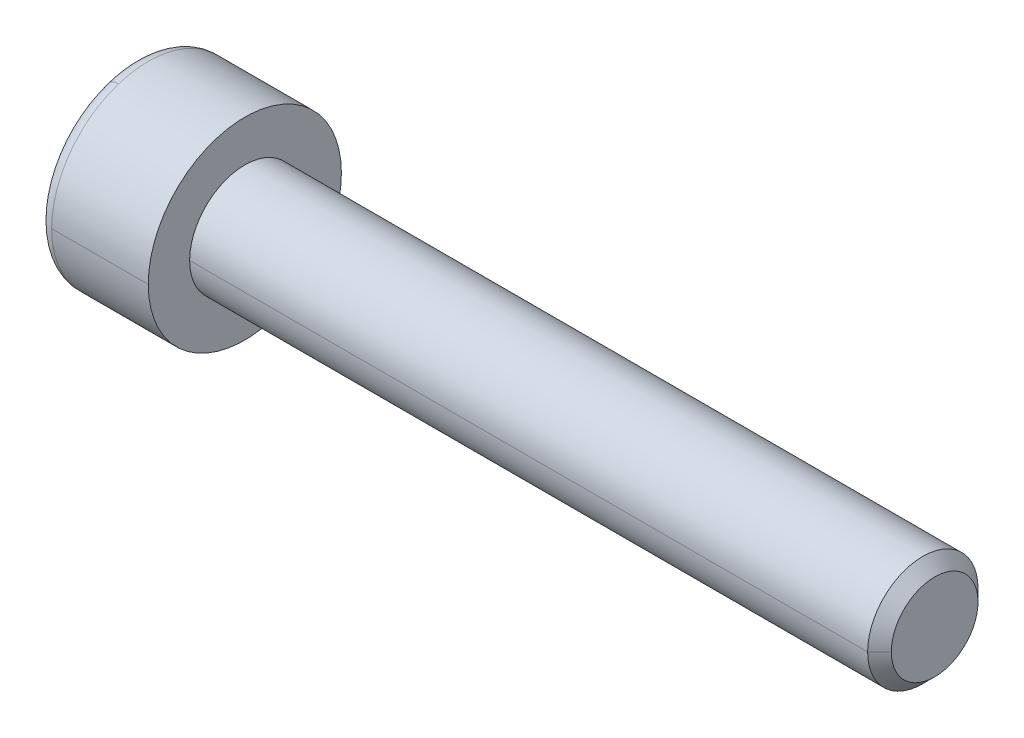
ISO-10303-21;
HEADER;
FILE_DESCRIPTION(('STEP AP214'),'2;1');
FILE_NAME('part.step','',(''),(''),'','','');
FILE_SCHEMA(('AUTOMOTIVE_DESIGN { 1 0 10303 214 1 1 1 1 }'));
ENDSEC;
DATA;
#1=APPLICATION_CONTEXT('core data for automotive mechanical design processes');
#2=APPLICATION_PROTOCOL_DEFINITION('international standard','automotive_design',2000,#1);
#3=PRODUCT_CONTEXT('',#1,'mechanical');
#4=PRODUCT('Part','Part','',(#3));
#5=PRODUCT_RELATED_PRODUCT_CATEGORY('part','',(#4));
#6=PRODUCT_DEFINITION_FORMATION('','',#4);
#7=PRODUCT_DEFINITION_CONTEXT('part definition',#1,'design');
#8=PRODUCT_DEFINITION('design','',#6,#7);
#9=PRODUCT_DEFINITION_SHAPE('','',#8);
#10=(LENGTH_UNIT() NAMED_UNIT(*) SI_UNIT(.MILLI.,.METRE.));
#11=(NAMED_UNIT(*) PLANE_ANGLE_UNIT() SI_UNIT($,.RADIAN.));
#12=(NAMED_UNIT(*) SI_UNIT($,.STERADIAN.) SOLID_ANGLE_UNIT());
#13=UNCERTAINTY_MEASURE_WITH_UNIT(LENGTH_MEASURE(1.E-05),#10,'distance_accuracy_value','');
#14=(GEOMETRIC_REPRESENTATION_CONTEXT(3) GLOBAL_UNCERTAINTY_ASSIGNED_CONTEXT((#13)) GLOBAL_UNIT_ASSIGNED_CONTEXT((#10,
#11,#12)) REPRESENTATION_CONTEXT('',''));
#15=CARTESIAN_POINT('',(0.,0.,0.));
#16=DIRECTION('',(0.,0.,1.));
#17=DIRECTION('',(1.,0.,0.));
#18=AXIS2_PLACEMENT_3D('',#15,#16,#17);
#19=CARTESIAN_POINT('',(-2.,0.,0.));
#20=DIRECTION('',(1.,0.,0.));
#21=DIRECTION('',(0.,0.,-1.));
#22=AXIS2_PLACEMENT_3D('',#19,#20,#21);
#23=PLANE('',#22);
#24=CARTESIAN_POINT('',(-2.,0.,0.));
#25=DIRECTION('',(-1.,0.,0.));
#26=DIRECTION('',(0.,0.,-1.));
#27=AXIS2_PLACEMENT_3D('',#24,#25,#26);
#28=CIRCLE('',#27,1.5);
#29=CARTESIAN_POINT('',(-2.,-1.29903810567665,-0.750000000000014));
#30=VERTEX_POINT('',#29);
#31=CARTESIAN_POINT('',(-2.,-1.29903810567665,0.750000000000014));
#32=VERTEX_POINT('',#31);
#33=EDGE_CURVE('E11',#30,#32,#28,.T.);
#34=ORIENTED_EDGE('',*,*,#33,.F.);
#35=DIRECTION('',(0.,0.500000000000009,-0.866025403784433));
#36=VECTOR('',#35,1.);
#37=CARTESIAN_POINT('',(-2.,-1.7320508075689,0.));
#38=LINE('',#37,#36);
#39=CARTESIAN_POINT('',(-2.,-1.7320508075689,0.));
#40=VERTEX_POINT('',#39);
#41=EDGE_CURVE('E24',#40,#30,#38,.T.);
#42=ORIENTED_EDGE('',*,*,#41,.F.);
#43=DIRECTION('',(0.,-0.500000000000009,-0.866025403784433));
#44=VECTOR('',#43,1.);
#45=CARTESIAN_POINT('',(-2.,-0.86602540378444,1.5));
#46=LINE('',#45,#44);
#47=EDGE_CURVE('E384',#32,#40,#46,.T.);
#48=ORIENTED_EDGE('',*,*,#47,.F.);
#49=EDGE_LOOP('',(#34,#42,#48));
#50=FACE_BOUND('',#49,.T.);
#51=ADVANCED_FACE('F16',(#50),#23,.F.);
#52=CARTESIAN_POINT('',(-2.,-0.86602540378444,1.5));
#53=DIRECTION('',(0.,0.866025403784434,-0.500000000000009));
#54=DIRECTION('',(0.,0.500000000000009,0.866025403784434));
#55=AXIS2_PLACEMENT_3D('',#52,#53,#54);
#56=PLANE('',#55);
#57=DIRECTION('',(0.,-0.500000000000009,-0.866025403784433));
#58=VECTOR('',#57,1.);
#59=CARTESIAN_POINT('',(-4.,-0.86602540378444,1.5));
#60=LINE('',#59,#58);
#61=CARTESIAN_POINT('',(-4.,-0.86602540378444,1.5));
#62=VERTEX_POINT('',#61);
#63=CARTESIAN_POINT('',(-4.,-1.7320508075689,0.));
#64=VERTEX_POINT('',#63);
#65=EDGE_CURVE('E379',#62,#64,#60,.T.);
#66=ORIENTED_EDGE('',*,*,#65,.F.);
#67=DIRECTION('',(-1.,0.,0.));
#68=VECTOR('',#67,1.);
#69=CARTESIAN_POINT('',(-2.,-0.86602540378444,1.5));
#70=LINE('',#69,#68);
#71=CARTESIAN_POINT('',(-2.,-0.86602540378444,1.5));
#72=VERTEX_POINT('',#71);
#73=EDGE_CURVE('E374',#72,#62,#70,.T.);
#74=ORIENTED_EDGE('',*,*,#73,.F.);
#75=DIRECTION('',(0.,-0.500000000000009,-0.866025403784433));
#76=VECTOR('',#75,1.);
#77=CARTESIAN_POINT('',(-2.,-0.86602540378444,1.5));
#78=LINE('',#77,#76);
#79=EDGE_CURVE('E369',#72,#32,#78,.T.);
#80=ORIENTED_EDGE('',*,*,#79,.T.);
#81=ORIENTED_EDGE('',*,*,#47,.T.);
#82=DIRECTION('',(-1.,0.,0.));
#83=VECTOR('',#82,1.);
#84=CARTESIAN_POINT('',(-2.,-1.7320508075689,0.));
#85=LINE('',#84,#83);
#86=EDGE_CURVE('E365',#40,#64,#85,.T.);
#87=ORIENTED_EDGE('',*,*,#86,.T.);
#88=EDGE_LOOP('',(#66,#74,#80,#81,#87));
#89=FACE_BOUND('',#88,.T.);
#90=ADVANCED_FACE('F412',(#89),#56,.T.);
#91=CARTESIAN_POINT('',(-2.,-1.7320508075689,0.));
#92=DIRECTION('',(0.,0.866025403784434,0.500000000000009));
#93=DIRECTION('',(0.,-0.500000000000009,0.866025403784434));
#94=AXIS2_PLACEMENT_3D('',#91,#92,#93);
#95=PLANE('',#94);
#96=DIRECTION('',(0.,0.500000000000009,-0.866025403784433));
#97=VECTOR('',#96,1.);
#98=CARTESIAN_POINT('',(-4.,-1.7320508075689,0.));
#99=LINE('',#98,#97);
#100=CARTESIAN_POINT('',(-4.,-0.86602540378444,-1.5));
#101=VERTEX_POINT('',#100);
#102=EDGE_CURVE('E360',#64,#101,#99,.T.);
#103=ORIENTED_EDGE('',*,*,#102,.F.);
#104=ORIENTED_EDGE('',*,*,#86,.F.);
#105=ORIENTED_EDGE('',*,*,#41,.T.);
#106=DIRECTION('',(0.,0.500000000000009,-0.866025403784433));
#107=VECTOR('',#106,1.);
#108=CARTESIAN_POINT('',(-2.,-1.7320508075689,0.));
#109=LINE('',#108,#107);
#110=CARTESIAN_POINT('',(-2.,-0.86602540378444,-1.5));
#111=VERTEX_POINT('',#110);
#112=EDGE_CURVE('E356',#30,#111,#109,.T.);
#113=ORIENTED_EDGE('',*,*,#112,.T.);
#114=DIRECTION('',(-1.,0.,0.));
#115=VECTOR('',#114,1.);
#116=CARTESIAN_POINT('',(-2.,-0.86602540378444,-1.5));
#117=LINE('',#116,#115);
#118=EDGE_CURVE('E352',#111,#101,#117,.T.);
#119=ORIENTED_EDGE('',*,*,#118,.T.);
#120=EDGE_LOOP('',(#103,#104,#105,#113,#119));
#121=FACE_BOUND('',#120,.T.);
#122=ADVANCED_FACE('F395',(#121),#95,.T.);
#123=CARTESIAN_POINT('',(-2.,-0.86602540378444,-1.5));
#124=DIRECTION('',(0.,0.,1.));
#125=DIRECTION('',(1.,0.,0.));
#126=AXIS2_PLACEMENT_3D('',#123,#124,#125);
#127=PLANE('',#126);
#128=DIRECTION('',(0.,1.,0.));
#129=VECTOR('',#128,1.);
#130=CARTESIAN_POINT('',(-4.,-0.86602540378444,-1.5));
#131=LINE('',#130,#129);
#132=CARTESIAN_POINT('',(-4.,0.86602540378444,-1.5));
#133=VERTEX_POINT('',#132);
#134=EDGE_CURVE('E347',#101,#133,#131,.T.);
#135=ORIENTED_EDGE('',*,*,#134,.F.);
#136=ORIENTED_EDGE('',*,*,#118,.F.);
#137=DIRECTION('',(0.,1.,0.));
#138=VECTOR('',#137,1.);
#139=CARTESIAN_POINT('',(-2.,-0.86602540378444,-1.5));
#140=LINE('',#139,#138);
#141=CARTESIAN_POINT('',(-2.,0.,-1.5));
#142=VERTEX_POINT('',#141);
#143=EDGE_CURVE('E343',#111,#142,#140,.T.);
#144=ORIENTED_EDGE('',*,*,#143,.T.);
#145=DIRECTION('',(0.,1.,0.));
#146=VECTOR('',#145,1.);
#147=CARTESIAN_POINT('',(-2.,-0.86602540378444,-1.5));
#148=LINE('',#147,#146);
#149=CARTESIAN_POINT('',(-2.,0.86602540378444,-1.5));
#150=VERTEX_POINT('',#149);
#151=EDGE_CURVE('E339',#142,#150,#148,.T.);
#152=ORIENTED_EDGE('',*,*,#151,.T.);
#153=DIRECTION('',(-1.,0.,0.));
#154=VECTOR('',#153,1.);
#155=CARTESIAN_POINT('',(-2.,0.86602540378444,-1.5));
#156=LINE('',#155,#154);
#157=EDGE_CURVE('E335',#150,#133,#156,.T.);
#158=ORIENTED_EDGE('',*,*,#157,.T.);
#159=EDGE_LOOP('',(#135,#136,#144,#152,#158));
#160=FACE_BOUND('',#159,.T.);
#161=ADVANCED_FACE('F408',(#160),#127,.T.);
#162=CARTESIAN_POINT('',(-2.,0.86602540378444,-1.5));
#163=DIRECTION('',(0.,-0.866025403784434,0.500000000000009));
#164=DIRECTION('',(0.,-0.500000000000009,-0.866025403784434));
#165=AXIS2_PLACEMENT_3D('',#162,#163,#164);
#166=PLANE('',#165);
#167=DIRECTION('',(0.,0.500000000000009,0.866025403784433));
#168=VECTOR('',#167,1.);
#169=CARTESIAN_POINT('',(-4.,0.86602540378444,-1.5));
#170=LINE('',#169,#168);
#171=CARTESIAN_POINT('',(-4.,1.7320508075689,0.));
#172=VERTEX_POINT('',#171);
#173=EDGE_CURVE('E330',#133,#172,#170,.T.);
#174=ORIENTED_EDGE('',*,*,#173,.F.);
#175=ORIENTED_EDGE('',*,*,#157,.F.);
#176=DIRECTION('',(0.,0.500000000000009,0.866025403784433));
#177=VECTOR('',#176,1.);
#178=CARTESIAN_POINT('',(-2.,0.86602540378444,-1.5));
#179=LINE('',#178,#177);
#180=CARTESIAN_POINT('',(-2.,1.29903810567666,-0.750000000000019));
#181=VERTEX_POINT('',#180);
#182=EDGE_CURVE('E326',#150,#181,#179,.T.);
#183=ORIENTED_EDGE('',*,*,#182,.T.);
#184=DIRECTION('',(0.,0.500000000000009,0.866025403784433));
#185=VECTOR('',#184,1.);
#186=CARTESIAN_POINT('',(-2.,0.86602540378444,-1.5));
#187=LINE('',#186,#185);
#188=CARTESIAN_POINT('',(-2.,1.7320508075689,0.));
#189=VERTEX_POINT('',#188);
#190=EDGE_CURVE('E322',#181,#189,#187,.T.);
#191=ORIENTED_EDGE('',*,*,#190,.T.);
#192=DIRECTION('',(-1.,0.,0.));
#193=VECTOR('',#192,1.);
#194=CARTESIAN_POINT('',(-2.,1.7320508075689,0.));
#195=LINE('',#194,#193);
#196=EDGE_CURVE('E318',#189,#172,#195,.T.);
#197=ORIENTED_EDGE('',*,*,#196,.T.);
#198=EDGE_LOOP('',(#174,#175,#183,#191,#197));
#199=FACE_BOUND('',#198,.T.);
#200=ADVANCED_FACE('F427',(#199),#166,.T.);
#201=CARTESIAN_POINT('',(-2.,1.7320508075689,0.));
#202=DIRECTION('',(0.,-0.866025403784434,-0.500000000000009));
#203=DIRECTION('',(0.,0.500000000000009,-0.866025403784434));
#204=AXIS2_PLACEMENT_3D('',#201,#202,#203);
#205=PLANE('',#204);
#206=DIRECTION('',(0.,-0.500000000000009,0.866025403784433));
#207=VECTOR('',#206,1.);
#208=CARTESIAN_POINT('',(-4.,1.7320508075689,0.));
#209=LINE('',#208,#207);
#210=CARTESIAN_POINT('',(-4.,0.86602540378444,1.5));
#211=VERTEX_POINT('',#210);
#212=EDGE_CURVE('E313',#172,#211,#209,.T.);
#213=ORIENTED_EDGE('',*,*,#212,.F.);
#214=ORIENTED_EDGE('',*,*,#196,.F.);
#215=DIRECTION('',(0.,-0.500000000000009,0.866025403784433));
#216=VECTOR('',#215,1.);
#217=CARTESIAN_POINT('',(-2.,1.7320508075689,0.));
#218=LINE('',#217,#216);
#219=CARTESIAN_POINT('',(-2.,1.29903810567665,0.750000000000014));
#220=VERTEX_POINT('',#219);
#221=EDGE_CURVE('E309',#189,#220,#218,.T.);
#222=ORIENTED_EDGE('',*,*,#221,.T.);
#223=DIRECTION('',(0.,-0.500000000000009,0.866025403784433));
#224=VECTOR('',#223,1.);
#225=CARTESIAN_POINT('',(-2.,1.7320508075689,0.));
#226=LINE('',#225,#224);
#227=CARTESIAN_POINT('',(-2.,0.86602540378444,1.5));
#228=VERTEX_POINT('',#227);
#229=EDGE_CURVE('E305',#220,#228,#226,.T.);
#230=ORIENTED_EDGE('',*,*,#229,.T.);
#231=DIRECTION('',(-1.,0.,0.));
#232=VECTOR('',#231,1.);
#233=CARTESIAN_POINT('',(-2.,0.86602540378444,1.5));
#234=LINE('',#233,#232);
#235=EDGE_CURVE('E301',#228,#211,#234,.T.);
#236=ORIENTED_EDGE('',*,*,#235,.T.);
#237=EDGE_LOOP('',(#213,#214,#222,#230,#236));
#238=FACE_BOUND('',#237,.T.);
#239=ADVANCED_FACE('F430',(#238),#205,.T.);
#240=CARTESIAN_POINT('',(-2.,0.86602540378444,1.5));
#241=DIRECTION('',(0.,0.,-1.));
#242=DIRECTION('',(-1.,0.,0.));
#243=AXIS2_PLACEMENT_3D('',#240,#241,#242);
#244=PLANE('',#243);
#245=DIRECTION('',(0.,-1.,0.));
#246=VECTOR('',#245,1.);
#247=CARTESIAN_POINT('',(-4.,0.86602540378444,1.5));
#248=LINE('',#247,#246);
#249=EDGE_CURVE('E296',#211,#62,#248,.T.);
#250=ORIENTED_EDGE('',*,*,#249,.F.);
#251=ORIENTED_EDGE('',*,*,#235,.F.);
#252=DIRECTION('',(0.,-1.,0.));
#253=VECTOR('',#252,1.);
#254=CARTESIAN_POINT('',(-2.,0.86602540378444,1.5));
#255=LINE('',#254,#253);
#256=CARTESIAN_POINT('',(-2.,0.,1.5));
#257=VERTEX_POINT('',#256);
#258=EDGE_CURVE('E292',#228,#257,#255,.T.);
#259=ORIENTED_EDGE('',*,*,#258,.T.);
#260=DIRECTION('',(0.,-1.,0.));
#261=VECTOR('',#260,1.);
#262=CARTESIAN_POINT('',(-2.,0.86602540378444,1.5));
#263=LINE('',#262,#261);
#264=EDGE_CURVE('E287',#257,#72,#263,.T.);
#265=ORIENTED_EDGE('',*,*,#264,.T.);
#266=ORIENTED_EDGE('',*,*,#73,.T.);
#267=EDGE_LOOP('',(#250,#251,#259,#265,#266));
#268=FACE_BOUND('',#267,.T.);
#269=ADVANCED_FACE('F434',(#268),#244,.T.);
#270=CARTESIAN_POINT('',(-2.,0.,0.));
#271=DIRECTION('',(1.,0.,0.));
#272=DIRECTION('',(0.,0.,-1.));
#273=AXIS2_PLACEMENT_3D('',#270,#271,#272);
#274=PLANE('',#273);
#275=CARTESIAN_POINT('',(-2.,0.,0.));
#276=DIRECTION('',(-1.,0.,0.));
#277=DIRECTION('',(0.,0.,-1.));
#278=AXIS2_PLACEMENT_3D('',#275,#276,#277);
#279=CIRCLE('',#278,1.5);
#280=EDGE_CURVE('E282',#32,#257,#279,.T.);
#281=ORIENTED_EDGE('',*,*,#280,.F.);
#282=ORIENTED_EDGE('',*,*,#79,.F.);
#283=ORIENTED_EDGE('',*,*,#264,.F.);
#284=EDGE_LOOP('',(#281,#282,#283));
#285=FACE_BOUND('',#284,.T.);
#286=ADVANCED_FACE('F438',(#285),#274,.F.);
#287=CARTESIAN_POINT('',(-2.,0.,0.));
#288=DIRECTION('',(-1.,0.,0.));
#289=DIRECTION('',(0.,1.,0.));
#290=AXIS2_PLACEMENT_3D('',#287,#288,#289);
#291=CONICAL_SURFACE('',#290,1.5,1.02974425867667);
#292=DIRECTION('',(-0.515038074910037,0.,-0.857167300702123));
#293=VECTOR('',#292,1.);
#294=CARTESIAN_POINT('',(-1.0987090714587,0.,0.));
#295=LINE('',#294,#293);
#296=CARTESIAN_POINT('',(-1.0987090714587,0.,0.));
#297=VERTEX_POINT('',#296);
#298=EDGE_CURVE('E277',#297,#142,#295,.T.);
#299=ORIENTED_EDGE('',*,*,#298,.T.);
#300=CARTESIAN_POINT('',(-2.,0.,0.));
#301=DIRECTION('',(-1.,0.,0.));
#302=DIRECTION('',(0.,0.,-1.));
#303=AXIS2_PLACEMENT_3D('',#300,#301,#302);
#304=CIRCLE('',#303,1.5);
#305=EDGE_CURVE('E272',#142,#30,#304,.T.);
#306=ORIENTED_EDGE('',*,*,#305,.T.);
#307=ORIENTED_EDGE('',*,*,#33,.T.);
#308=ORIENTED_EDGE('',*,*,#280,.T.);
#309=DIRECTION('',(-0.515038074910037,0.,0.857167300702123));
#310=VECTOR('',#309,1.);
#311=CARTESIAN_POINT('',(-1.0987090714587,0.,0.));
#312=LINE('',#311,#310);
#313=EDGE_CURVE('E267',#297,#257,#312,.T.);
#314=ORIENTED_EDGE('',*,*,#313,.F.);
#315=EDGE_LOOP('',(#299,#306,#307,#308,#314));
#316=FACE_BOUND('',#315,.T.);
#317=ADVANCED_FACE('F400',(#316),#291,.F.);
#318=CARTESIAN_POINT('',(-2.,0.,0.));
#319=DIRECTION('',(-1.,0.,0.));
#320=DIRECTION('',(0.,-1.,0.));
#321=AXIS2_PLACEMENT_3D('',#318,#319,#320);
#322=CONICAL_SURFACE('',#321,1.5,1.02974425867667);
#323=ORIENTED_EDGE('',*,*,#313,.T.);
#324=CARTESIAN_POINT('',(-2.,0.,0.));
#325=DIRECTION('',(-1.,0.,0.));
#326=DIRECTION('',(0.,0.,-1.));
#327=AXIS2_PLACEMENT_3D('',#324,#325,#326);
#328=CIRCLE('',#327,1.5);
#329=EDGE_CURVE('E262',#257,#220,#328,.T.);
#330=ORIENTED_EDGE('',*,*,#329,.T.);
#331=CARTESIAN_POINT('',(-2.,0.,0.));
#332=DIRECTION('',(-1.,0.,0.));
#333=DIRECTION('',(0.,0.,-1.));
#334=AXIS2_PLACEMENT_3D('',#331,#332,#333);
#335=CIRCLE('',#334,1.5);
#336=EDGE_CURVE('E257',#220,#181,#335,.T.);
#337=ORIENTED_EDGE('',*,*,#336,.T.);
#338=CARTESIAN_POINT('',(-2.,0.,0.));
#339=DIRECTION('',(-1.,0.,0.));
#340=DIRECTION('',(0.,0.,-1.));
#341=AXIS2_PLACEMENT_3D('',#338,#339,#340);
#342=CIRCLE('',#341,1.5);
#343=EDGE_CURVE('E254',#181,#142,#342,.T.);
#344=ORIENTED_EDGE('',*,*,#343,.T.);
#345=ORIENTED_EDGE('',*,*,#298,.F.);
#346=EDGE_LOOP('',(#323,#330,#337,#344,#345));
#347=FACE_BOUND('',#346,.T.);
#348=ADVANCED_FACE('F445',(#347),#322,.F.);
#349=CARTESIAN_POINT('',(-2.,0.,0.));
#350=DIRECTION('',(1.,0.,0.));
#351=DIRECTION('',(0.,0.,-1.));
#352=AXIS2_PLACEMENT_3D('',#349,#350,#351);
#353=PLANE('',#352);
#354=ORIENTED_EDGE('',*,*,#343,.F.);
#355=ORIENTED_EDGE('',*,*,#182,.F.);
#356=ORIENTED_EDGE('',*,*,#151,.F.);
#357=EDGE_LOOP('',(#354,#355,#356));
#358=FACE_BOUND('',#357,.T.);
#359=ADVANCED_FACE('F448',(#358),#353,.F.);
#360=CARTESIAN_POINT('',(-2.,0.,0.));
#361=DIRECTION('',(1.,0.,0.));
#362=DIRECTION('',(0.,0.,-1.));
#363=AXIS2_PLACEMENT_3D('',#360,#361,#362);
#364=PLANE('',#363);
#365=ORIENTED_EDGE('',*,*,#336,.F.);
#366=ORIENTED_EDGE('',*,*,#221,.F.);
#367=ORIENTED_EDGE('',*,*,#190,.F.);
#368=EDGE_LOOP('',(#365,#366,#367));
#369=FACE_BOUND('',#368,.T.);
#370=ADVANCED_FACE('F452',(#369),#364,.F.);
#371=CARTESIAN_POINT('',(-2.,0.,0.));
#372=DIRECTION('',(1.,0.,0.));
#373=DIRECTION('',(0.,0.,-1.));
#374=AXIS2_PLACEMENT_3D('',#371,#372,#373);
#375=PLANE('',#374);
#376=ORIENTED_EDGE('',*,*,#329,.F.);
#377=ORIENTED_EDGE('',*,*,#258,.F.);
#378=ORIENTED_EDGE('',*,*,#229,.F.);
#379=EDGE_LOOP('',(#376,#377,#378));
#380=FACE_BOUND('',#379,.T.);
#381=ADVANCED_FACE('F456',(#380),#375,.F.);
#382=CARTESIAN_POINT('',(-2.,0.,0.));
#383=DIRECTION('',(1.,0.,0.));
#384=DIRECTION('',(0.,0.,-1.));
#385=AXIS2_PLACEMENT_3D('',#382,#383,#384);
#386=PLANE('',#385);
#387=ORIENTED_EDGE('',*,*,#305,.F.);
#388=ORIENTED_EDGE('',*,*,#143,.F.);
#389=ORIENTED_EDGE('',*,*,#112,.F.);
#390=EDGE_LOOP('',(#387,#388,#389));
#391=FACE_BOUND('',#390,.T.);
#392=ADVANCED_FACE('F404',(#391),#386,.F.);
#393=CARTESIAN_POINT('',(-4.,0.,0.));
#394=DIRECTION('',(1.,0.,0.));
#395=DIRECTION('',(0.,0.,-1.));
#396=AXIS2_PLACEMENT_3D('',#393,#394,#395);
#397=PLANE('',#396);
#398=CARTESIAN_POINT('',(-4.,2.85316954888554,0.927050983124878));
#399=CARTESIAN_POINT('',(-4.,2.83800168763055,0.973736229612141));
#400=CARTESIAN_POINT('',(-4.,2.82168608911883,1.0200484604974));
#401=CARTESIAN_POINT('',(-4.,2.78680300185109,1.11181694718517));
#402=CARTESIAN_POINT('',(-4.,2.76823551309507,1.15727320298769));
#403=CARTESIAN_POINT('',(-4.,2.7288922296079,1.24721979563124));
#404=CARTESIAN_POINT('',(-4.,2.70811643487675,1.29171013247228));
#405=CARTESIAN_POINT('',(-4.,2.66440689733559,1.37961782284063));
#406=CARTESIAN_POINT('',(-4.,2.64147315452557,1.42303517636794));
#407=CARTESIAN_POINT('',(-4.,2.59350288791136,1.50869227261389));
#408=CARTESIAN_POINT('',(-4.,2.56846636410716,1.55093201533254));
#409=CARTESIAN_POINT('',(-4.,2.51635087273839,1.63413213910462));
#410=CARTESIAN_POINT('',(-4.,2.48927190517383,1.67509252015806));
#411=CARTESIAN_POINT('',(-4.,2.4331367559794,1.75563524120773));
#412=CARTESIAN_POINT('',(-4.,2.40408057434953,1.79521758120396));
#413=CARTESIAN_POINT('',(-4.,2.34406099749456,1.87290886341706));
#414=CARTESIAN_POINT('',(-4.,2.31309760226945,1.91101780563394));
#415=CARTESIAN_POINT('',(-4.,2.24933819133086,1.9856704843473));
#416=CARTESIAN_POINT('',(-4.,2.21654217561738,2.02221422084378));
#417=CARTESIAN_POINT('',(-4.,2.14919653229019,2.09364845109751));
#418=CARTESIAN_POINT('',(-4.,2.11464690467647,2.12853894485475));
#419=CARTESIAN_POINT('',(-4.,2.04387727059746,2.1965826353629));
#420=CARTESIAN_POINT('',(-4.,2.00765726413216,2.22973583211381));
#421=CARTESIAN_POINT('',(-4.,1.9336341295262,2.29422505965755));
#422=CARTESIAN_POINT('',(-4.,1.89583100138555,2.32556109045038));
#423=CARTESIAN_POINT('',(-4.,1.81873269447356,2.38634049483424));
#424=CARTESIAN_POINT('',(-4.,1.77943751570222,2.41578386842527));
#425=CARTESIAN_POINT('',(-4.,1.69944977305696,2.47270702673983));
#426=CARTESIAN_POINT('',(-4.,1.65875720918303,2.50018681146336));
#427=CARTESIAN_POINT('',(-4.,1.57607272828306,2.55311659083452));
#428=CARTESIAN_POINT('',(-4.,1.53408081125701,2.57856658548215));
#429=CARTESIAN_POINT('',(-4.,1.448898786259,2.62737547343527));
#430=CARTESIAN_POINT('',(-4.,1.40570867828704,2.65073436674076));
#431=CARTESIAN_POINT('',(-4.,1.31823432015031,2.69530477838961));
#432=CARTESIAN_POINT('',(-4.,1.27395006998554,2.71651629673298));
#433=CARTESIAN_POINT('',(-4.,1.18439411210069,2.756740858052));
#434=CARTESIAN_POINT('',(-4.,1.13912240438061,2.77575390102764));
#435=CARTESIAN_POINT('',(-4.,1.04770059489435,2.81153570752535));
#436=CARTESIAN_POINT('',(-4.,1.00155049312817,2.82830447104741));
#437=CARTESIAN_POINT('',(-4.,0.90848307518717,2.85955732121783));
#438=CARTESIAN_POINT('',(-4.,0.861565759012337,2.8740414078662));
#439=CARTESIAN_POINT('',(-4.,0.767076940178147,2.90069001085586));
#440=CARTESIAN_POINT('',(-4.,0.71950543751879,2.91285452719715));
#441=CARTESIAN_POINT('',(-4.,0.62382284963223,2.9348346841873));
#442=CARTESIAN_POINT('',(-4.,0.575711764405027,2.94465032483616));
#443=CARTESIAN_POINT('',(-4.,0.479065915201121,2.96190908370337));
#444=CARTESIAN_POINT('',(-4.,0.430531151224417,2.96935220192173));
#445=CARTESIAN_POINT('',(-4.,0.333154869019074,2.98184798480421));
#446=CARTESIAN_POINT('',(-4.,0.284313350790434,2.98690064946833));
#447=CARTESIAN_POINT('',(-4.,0.18644122357664,2.99460335293062));
#448=CARTESIAN_POINT('',(-4.,0.137410614591487,2.99725339172877));
#449=CARTESIAN_POINT('',(-4.,0.0392784248962868,3.00014445928354));
#450=CARTESIAN_POINT('',(-4.,-0.00982315581375952,3.00038548804014));
#451=CARTESIAN_POINT('',(-4.,-0.107978998950024,2.99845795485242));
#452=CARTESIAN_POINT('',(-4.,-0.157033261376243,2.9962893929081));
#453=CARTESIAN_POINT('',(-4.,-0.254976291930022,2.98954790257418));
#454=CARTESIAN_POINT('',(-4.,-0.303865060057583,2.98497497418458));
#455=CARTESIAN_POINT('',(-4.,-0.401359324689475,2.97343576754516));
#456=CARTESIAN_POINT('',(-4.,-0.449964821193807,2.96646948929532));
#457=CARTESIAN_POINT('',(-4.,-0.546775447680826,2.9501603653099));
#458=CARTESIAN_POINT('',(-4.,-0.594980577663513,2.94081751957432));
#459=CARTESIAN_POINT('',(-4.,-0.690874340726841,2.91977776835109));
#460=CARTESIAN_POINT('',(-4.,-0.738562973807483,2.90808086286346));
#461=CARTESIAN_POINT('',(-4.,-0.8333088569726,2.882361171006));
#462=CARTESIAN_POINT('',(-4.,-0.880366107057074,2.86833838463617));
#463=CARTESIAN_POINT('',(-4.,-0.973735859192676,2.83800071313492));
#464=CARTESIAN_POINT('',(-4.,-1.0200483612438,2.82168582800351));
#465=CARTESIAN_POINT('',(-4.,-1.11181704643877,2.78680326296641));
#466=CARTESIAN_POINT('',(-4.,-1.15727322958261,2.76823558306071));
#467=CARTESIAN_POINT('',(-4.,-1.24721976903632,2.72889215964227));
#468=CARTESIAN_POINT('',(-4.,-1.29171012534619,2.70811641612952));
#469=CARTESIAN_POINT('',(-4.,-1.37961782996671,2.66440691608282));
#470=CARTESIAN_POINT('',(-4.,-1.42303517827736,2.64147315954888));
#471=CARTESIAN_POINT('',(-4.,-1.50869227070446,2.59350288288805));
#472=CARTESIAN_POINT('',(-4.,-1.55093201482091,2.56846636276117));
#473=CARTESIAN_POINT('',(-4.,-1.63413213961625,2.51635087408438));
#474=CARTESIAN_POINT('',(-4.,-1.67509252029515,2.48927190553448));
#475=CARTESIAN_POINT('',(-4.,-1.75563524107063,2.43313675561874));
#476=CARTESIAN_POINT('',(-4.,-1.79521758116722,2.4040805742529));
#477=CARTESIAN_POINT('',(-4.,-1.87290886345379,2.3440609975912));
#478=CARTESIAN_POINT('',(-4.,-1.91101780564378,2.31309760229535));
#479=CARTESIAN_POINT('',(-4.,-1.98567048433745,2.24933819130497));
#480=CARTESIAN_POINT('',(-4.,-2.02221422084114,2.21654217561045));
#481=CARTESIAN_POINT('',(-4.,-2.09364845110014,2.14919653229713));
#482=CARTESIAN_POINT('',(-4.,-2.12853894485546,2.11464690467833));
#483=CARTESIAN_POINT('',(-4.,-2.19658263536219,2.0438772705956));
#484=CARTESIAN_POINT('',(-4.,-2.22973583211362,2.00765726413166));
#485=CARTESIAN_POINT('',(-4.,-2.29422505965774,1.9336341295267));
#486=CARTESIAN_POINT('',(-4.,-2.32556109045043,1.89583100138568));
#487=CARTESIAN_POINT('',(-4.,-2.38634049483419,1.81873269447343));
#488=CARTESIAN_POINT('',(-4.,-2.41578386842525,1.77943751570219));
#489=CARTESIAN_POINT('',(-4.,-2.47270702673984,1.69944977305699));
#490=CARTESIAN_POINT('',(-4.,-2.50018681146336,1.65875720918304));
#491=CARTESIAN_POINT('',(-4.,-2.55311659083452,1.57607272828305));
#492=CARTESIAN_POINT('',(-4.,-2.57856658548215,1.53408081125701));
#493=CARTESIAN_POINT('',(-4.,-2.62737547343527,1.448898786259));
#494=CARTESIAN_POINT('',(-4.,-2.65073436674076,1.40570867828704));
#495=CARTESIAN_POINT('',(-4.,-2.69530477838961,1.31823432015032));
#496=CARTESIAN_POINT('',(-4.,-2.71651629673298,1.27395006998555));
#497=CARTESIAN_POINT('',(-4.,-2.756740858052,1.18439411210069));
#498=CARTESIAN_POINT('',(-4.,-2.77575390102765,1.1391224043806));
#499=CARTESIAN_POINT('',(-4.,-2.81153570752534,1.04770059489435));
#500=CARTESIAN_POINT('',(-4.,-2.82830447104737,1.00155049312819));
#501=CARTESIAN_POINT('',(-4.,-2.85955732121787,0.908483075187162));
#502=CARTESIAN_POINT('',(-4.,-2.87404140786634,0.861565759012302));
#503=CARTESIAN_POINT('',(-4.,-2.90069001085572,0.767076940178187));
#504=CARTESIAN_POINT('',(-4.,-2.91285452719663,0.719505437518933));
#505=CARTESIAN_POINT('',(-4.,-2.93483468418781,0.623822849632094));
#506=CARTESIAN_POINT('',(-4.,-2.94465032483808,0.57571176440451));
#507=CARTESIAN_POINT('',(-4.,-2.96190908370145,0.479065915201645));
#508=CARTESIAN_POINT('',(-4.,-2.96935220191456,0.430531151226364));
#509=CARTESIAN_POINT('',(-4.,-2.98184798481137,0.333154869017131));
#510=CARTESIAN_POINT('',(-4.,-2.98690064949507,0.284313350783178));
#511=CARTESIAN_POINT('',(-4.,-2.99460335290388,0.186441223583899));
#512=CARTESIAN_POINT('',(-4.,-2.997253391629,0.137410614618573));
#513=CARTESIAN_POINT('',(-4.,-3.00014445938331,0.0392784248692053));
#514=CARTESIAN_POINT('',(-4.,-3.0003854884125,-0.00982315591483674));
#515=CARTESIAN_POINT('',(-4.,-2.99845795448007,-0.107978998848941));
#516=CARTESIAN_POINT('',(-4.,-2.99628939151844,-0.157033260999004));
#517=CARTESIAN_POINT('',(-4.,-2.98954790396383,-0.254976292307256));
#518=CARTESIAN_POINT('',(-4.,-2.98497497937086,-0.303865061465445));
#519=CARTESIAN_POINT('',(-4.,-2.97343576235888,-0.401359323281609));
#520=CARTESIAN_POINT('',(-4.,-2.96646946993988,-0.449964815939583));
#521=CARTESIAN_POINT('',(-4.,-2.95016038466535,-0.546775452935047));
#522=CARTESIAN_POINT('',(-4.,-2.94081759180981,-0.594980597272538));
#523=CARTESIAN_POINT('',(-4.,-2.9197776961156,-0.690874321117811));
#524=CARTESIAN_POINT('',(-4.,-2.90808059327693,-0.738562900625594));
#525=CARTESIAN_POINT('',(-4.,-2.88236144059252,-0.833308930154483));
#526=CARTESIAN_POINT('',(-4.,-2.86833939074679,-0.880366380175589));
#527=CARTESIAN_POINT('',(-4.,-2.85316954888555,-0.927050983124872));
#528=B_SPLINE_CURVE_WITH_KNOTS('',3,(#398,#399,#400,#401,#402,#403,#404,#405,#406,#407,#408,
#409,#410,#411,#412,#413,#414,#415,#416,#417,#418,#419,#420,#421,#422,#423,#424,#425,#426,#427,
#428,#429,#430,#431,#432,#433,#434,#435,#436,#437,#438,#439,#440,#441,#442,#443,#444,#445,#446,
#447,#448,#449,#450,#451,#452,#453,#454,#455,#456,#457,#458,#459,#460,#461,#462,#463,#464,#465,
#466,#467,#468,#469,#470,#471,#472,#473,#474,#475,#476,#477,#478,#479,#480,#481,#482,#483,#484,
#485,#486,#487,#488,#489,#490,#491,#492,#493,#494,#495,#496,#497,#498,#499,#500,#501,#502,#503,
#504,#505,#506,#507,#508,#509,#510,#511,#512,#513,#514,#515,#516,#517,#518,#519,#520,#521,#522,
#523,#524,#525,#526,#527),.UNSPECIFIED.,.F.,.F.,(4,2,2,2,2,2,2,2,2,2,2,2,2,2,2,2,2,2,2,2,2,2,2,
2,2,2,2,2,2,2,2,2,2,2,2,2,2,2,2,2,2,2,2,2,2,2,2,2,2,2,2,2,2,2,2,2,2,2,2,2,2,2,2,2,4),(0.,
0.147247371137477,0.294494742274956,0.441742113412434,0.588989484549913,0.73623685568739,
0.883484226824869,1.03073159796235,1.17797896909983,1.3252263402373,1.47247371137478,
1.61972108251226,1.76696845364974,1.91421582478721,2.06146319592469,2.20871056706217,
2.35595793819965,2.50320530933713,2.65045268047461,2.79770005161208,2.94494742274956,
3.09219479388704,3.23944216502452,3.386689536162,3.53393690729947,3.68118427843695,
3.82843164957443,3.97567902071191,4.12292639184939,4.27017376298686,4.41742113412434,
4.56466850526182,4.7119158763993,4.85916324753678,5.00641061867425,5.15365798981173,
5.30090536094921,5.44815273208669,5.59540010322417,5.74264747436164,5.88989484549912,
6.0371422166366,6.18438958777408,6.33163695891156,6.47888433004904,6.62613170118651,
6.77337907232399,6.92062644346147,7.06787381459895,7.21512118573643,7.3623685568739,
7.50961592801138,7.65686329914886,7.80411067028634,7.95135804142381,8.09860541256129,
8.24585278369877,8.39310015483625,8.54034752597373,8.68759489711121,8.83484226824869,
8.98208963938616,9.12933701052364,9.27658438166112,9.4238317527986),.UNSPECIFIED.);
#529=CARTESIAN_POINT('',(-4.,2.85316954888555,0.927050983124869));
#530=VERTEX_POINT('',#529);
#531=CARTESIAN_POINT('',(-4.,-2.85316954888555,-0.927050983124869));
#532=VERTEX_POINT('',#531);
#533=EDGE_CURVE('E252',#530,#532,#528,.T.);
#534=ORIENTED_EDGE('',*,*,#533,.F.);
#535=CARTESIAN_POINT('',(-4.,-2.85316954888554,-0.927050983124877));
#536=CARTESIAN_POINT('',(-4.,-2.83800168763055,-0.973736229612141));
#537=CARTESIAN_POINT('',(-4.,-2.82168608911883,-1.0200484604974));
#538=CARTESIAN_POINT('',(-4.,-2.78680300185109,-1.11181694718517));
#539=CARTESIAN_POINT('',(-4.,-2.76823551309507,-1.15727320298769));
#540=CARTESIAN_POINT('',(-4.,-2.7288922296079,-1.24721979563124));
#541=CARTESIAN_POINT('',(-4.,-2.70811643487675,-1.29171013247228));
#542=CARTESIAN_POINT('',(-4.,-2.66440689733559,-1.37961782284062));
#543=CARTESIAN_POINT('',(-4.,-2.64147315452557,-1.42303517636794));
#544=CARTESIAN_POINT('',(-4.,-2.59350288791136,-1.50869227261389));
#545=CARTESIAN_POINT('',(-4.,-2.56846636410716,-1.55093201533254));
#546=CARTESIAN_POINT('',(-4.,-2.51635087273839,-1.63413213910462));
#547=CARTESIAN_POINT('',(-4.,-2.48927190517383,-1.67509252015806));
#548=CARTESIAN_POINT('',(-4.,-2.4331367559794,-1.75563524120773));
#549=CARTESIAN_POINT('',(-4.,-2.40408057434954,-1.79521758120396));
#550=CARTESIAN_POINT('',(-4.,-2.34406099749456,-1.87290886341706));
#551=CARTESIAN_POINT('',(-4.,-2.31309760226945,-1.91101780563393));
#552=CARTESIAN_POINT('',(-4.,-2.24933819133086,-1.98567048434729));
#553=CARTESIAN_POINT('',(-4.,-2.21654217561738,-2.02221422084378));
#554=CARTESIAN_POINT('',(-4.,-2.14919653229019,-2.09364845109751));
#555=CARTESIAN_POINT('',(-4.,-2.11464690467647,-2.12853894485475));
#556=CARTESIAN_POINT('',(-4.,-2.04387727059746,-2.1965826353629));
#557=CARTESIAN_POINT('',(-4.,-2.00765726413216,-2.22973583211381));
#558=CARTESIAN_POINT('',(-4.,-1.9336341295262,-2.29422505965755));
#559=CARTESIAN_POINT('',(-4.,-1.89583100138555,-2.32556109045038));
#560=CARTESIAN_POINT('',(-4.,-1.81873269447356,-2.38634049483424));
#561=CARTESIAN_POINT('',(-4.,-1.77943751570222,-2.41578386842526));
#562=CARTESIAN_POINT('',(-4.,-1.69944977305696,-2.47270702673982));
#563=CARTESIAN_POINT('',(-4.,-1.65875720918303,-2.50018681146336));
#564=CARTESIAN_POINT('',(-4.,-1.57607272828306,-2.55311659083452));
#565=CARTESIAN_POINT('',(-4.,-1.53408081125701,-2.57856658548215));
#566=CARTESIAN_POINT('',(-4.,-1.448898786259,-2.62737547343527));
#567=CARTESIAN_POINT('',(-4.,-1.40570867828704,-2.65073436674076));
#568=CARTESIAN_POINT('',(-4.,-1.31823432015032,-2.69530477838961));
#569=CARTESIAN_POINT('',(-4.,-1.27395006998555,-2.71651629673298));
#570=CARTESIAN_POINT('',(-4.,-1.18439411210069,-2.75674085805199));
#571=CARTESIAN_POINT('',(-4.,-1.13912240438061,-2.77575390102764));
#572=CARTESIAN_POINT('',(-4.,-1.04770059489435,-2.81153570752535));
#573=CARTESIAN_POINT('',(-4.,-1.00155049312818,-2.8283044710474));
#574=CARTESIAN_POINT('',(-4.,-0.908483075187173,-2.85955732121783));
#575=CARTESIAN_POINT('',(-4.,-0.86156575901234,-2.8740414078662));
#576=CARTESIAN_POINT('',(-4.,-0.76707694017815,-2.90069001085586));
#577=CARTESIAN_POINT('',(-4.,-0.719505437518793,-2.91285452719715));
#578=CARTESIAN_POINT('',(-4.,-0.623822849632234,-2.9348346841873));
#579=CARTESIAN_POINT('',(-4.,-0.575711764405031,-2.94465032483616));
#580=CARTESIAN_POINT('',(-4.,-0.479065915201125,-2.96190908370337));
#581=CARTESIAN_POINT('',(-4.,-0.430531151224422,-2.96935220192173));
#582=CARTESIAN_POINT('',(-4.,-0.333154869019078,-2.98184798480421));
#583=CARTESIAN_POINT('',(-4.,-0.284313350790438,-2.98690064946833));
#584=CARTESIAN_POINT('',(-4.,-0.186441223576644,-2.99460335293061));
#585=CARTESIAN_POINT('',(-4.,-0.13741061459149,-2.99725339172877));
#586=CARTESIAN_POINT('',(-4.,-0.0392784248962903,-3.00014445928354));
#587=CARTESIAN_POINT('',(-4.,0.00982315581375563,-3.00038548804014));
#588=CARTESIAN_POINT('',(-4.,0.10797899895002,-2.99845795485242));
#589=CARTESIAN_POINT('',(-4.,0.157033261376238,-2.9962893929081));
#590=CARTESIAN_POINT('',(-4.,0.254976291930017,-2.98954790257418));
#591=CARTESIAN_POINT('',(-4.,0.303865060057577,-2.98497497418458));
#592=CARTESIAN_POINT('',(-4.,0.401359324689469,-2.97343576754516));
#593=CARTESIAN_POINT('',(-4.,0.449964821193802,-2.96646948929533));
#594=CARTESIAN_POINT('',(-4.,0.54677544768082,-2.95016036530991));
#595=CARTESIAN_POINT('',(-4.,0.594980577663507,-2.94081751957432));
#596=CARTESIAN_POINT('',(-4.,0.690874340726836,-2.91977776835109));
#597=CARTESIAN_POINT('',(-4.,0.738562973807477,-2.90808086286346));
#598=CARTESIAN_POINT('',(-4.,0.833308856972594,-2.882361171006));
#599=CARTESIAN_POINT('',(-4.,0.880366107057069,-2.86833838463617));
#600=CARTESIAN_POINT('',(-4.,0.97373585919267,-2.83800071313493));
#601=CARTESIAN_POINT('',(-4.,1.0200483612438,-2.82168582800352));
#602=CARTESIAN_POINT('',(-4.,1.11181704643876,-2.78680326296641));
#603=CARTESIAN_POINT('',(-4.,1.1572732295826,-2.76823558306071));
#604=CARTESIAN_POINT('',(-4.,1.24721976903631,-2.72889215964227));
#605=CARTESIAN_POINT('',(-4.,1.29171012534618,-2.70811641612952));
#606=CARTESIAN_POINT('',(-4.,1.37961782996671,-2.66440691608283));
#607=CARTESIAN_POINT('',(-4.,1.42303517827736,-2.64147315954888));
#608=CARTESIAN_POINT('',(-4.,1.50869227070446,-2.59350288288806));
#609=CARTESIAN_POINT('',(-4.,1.5509320148209,-2.56846636276117));
#610=CARTESIAN_POINT('',(-4.,1.63413213961625,-2.51635087408439));
#611=CARTESIAN_POINT('',(-4.,1.67509252029514,-2.48927190553449));
#612=CARTESIAN_POINT('',(-4.,1.75563524107063,-2.43313675561874));
#613=CARTESIAN_POINT('',(-4.,1.79521758116722,-2.4040805742529));
#614=CARTESIAN_POINT('',(-4.,1.87290886345379,-2.34406099759121));
#615=CARTESIAN_POINT('',(-4.,1.91101780564377,-2.31309760229535));
#616=CARTESIAN_POINT('',(-4.,1.98567048433744,-2.24933819130497));
#617=CARTESIAN_POINT('',(-4.,2.02221422084114,-2.21654217561045));
#618=CARTESIAN_POINT('',(-4.,2.09364845110014,-2.14919653229713));
#619=CARTESIAN_POINT('',(-4.,2.12853894485545,-2.11464690467834));
#620=CARTESIAN_POINT('',(-4.,2.19658263536219,-2.0438772705956));
#621=CARTESIAN_POINT('',(-4.,2.22973583211361,-2.00765726413167));
#622=CARTESIAN_POINT('',(-4.,2.29422505965773,-1.93363412952671));
#623=CARTESIAN_POINT('',(-4.,2.32556109045043,-1.89583100138569));
#624=CARTESIAN_POINT('',(-4.,2.38634049483418,-1.81873269447343));
#625=CARTESIAN_POINT('',(-4.,2.41578386842525,-1.77943751570219));
#626=CARTESIAN_POINT('',(-4.,2.47270702673983,-1.699449773057));
#627=CARTESIAN_POINT('',(-4.,2.50018681146335,-1.65875720918305));
#628=CARTESIAN_POINT('',(-4.,2.55311659083451,-1.57607272828306));
#629=CARTESIAN_POINT('',(-4.,2.57856658548215,-1.53408081125701));
#630=CARTESIAN_POINT('',(-4.,2.62737547343527,-1.44889878625901));
#631=CARTESIAN_POINT('',(-4.,2.65073436674075,-1.40570867828705));
#632=CARTESIAN_POINT('',(-4.,2.69530477838961,-1.31823432015032));
#633=CARTESIAN_POINT('',(-4.,2.71651629673297,-1.27395006998555));
#634=CARTESIAN_POINT('',(-4.,2.75674085805199,-1.1843941121007));
#635=CARTESIAN_POINT('',(-4.,2.77575390102765,-1.13912240438061));
#636=CARTESIAN_POINT('',(-4.,2.81153570752534,-1.04770059489436));
#637=CARTESIAN_POINT('',(-4.,2.82830447104736,-1.0015504931282));
#638=CARTESIAN_POINT('',(-4.,2.85955732121786,-0.90848307518717));
#639=CARTESIAN_POINT('',(-4.,2.87404140786633,-0.86156575901231));
#640=CARTESIAN_POINT('',(-4.,2.90069001085572,-0.767076940178195));
#641=CARTESIAN_POINT('',(-4.,2.91285452719663,-0.719505437518941));
#642=CARTESIAN_POINT('',(-4.,2.93483468418781,-0.623822849632102));
#643=CARTESIAN_POINT('',(-4.,2.94465032483807,-0.575711764404518));
#644=CARTESIAN_POINT('',(-4.,2.96190908370145,-0.479065915201654));
#645=CARTESIAN_POINT('',(-4.,2.96935220191456,-0.430531151226374));
#646=CARTESIAN_POINT('',(-4.,2.98184798481137,-0.333154869017142));
#647=CARTESIAN_POINT('',(-4.,2.98690064949507,-0.284313350783189));
#648=CARTESIAN_POINT('',(-4.,2.99460335290388,-0.18644122358391));
#649=CARTESIAN_POINT('',(-4.,2.997253391629,-0.137410614618584));
#650=CARTESIAN_POINT('',(-4.,3.00014445938331,-0.0392784248692163));
#651=CARTESIAN_POINT('',(-4.,3.0003854884125,0.00982315591482567));
#652=CARTESIAN_POINT('',(-4.,2.99845795448007,0.10797899884893));
#653=CARTESIAN_POINT('',(-4.,2.99628939151844,0.157033260998993));
#654=CARTESIAN_POINT('',(-4.,2.98954790396383,0.254976292307245));
#655=CARTESIAN_POINT('',(-4.,2.98497497937086,0.303865061465434));
#656=CARTESIAN_POINT('',(-4.,2.97343576235888,0.401359323281598));
#657=CARTESIAN_POINT('',(-4.,2.96646946993988,0.449964815939572));
#658=CARTESIAN_POINT('',(-4.,2.95016038466535,0.546775452935036));
#659=CARTESIAN_POINT('',(-4.,2.94081759180981,0.594980597272527));
#660=CARTESIAN_POINT('',(-4.,2.9197776961156,0.6908743211178));
#661=CARTESIAN_POINT('',(-4.,2.90808059327693,0.738562900625583));
#662=CARTESIAN_POINT('',(-4.,2.88236144059253,0.833308930154472));
#663=CARTESIAN_POINT('',(-4.,2.86833939074679,0.880366380175578));
#664=CARTESIAN_POINT('',(-4.,2.85316954888555,0.927050983124861));
#665=B_SPLINE_CURVE_WITH_KNOTS('',3,(#535,#536,#537,#538,#539,#540,#541,#542,#543,#544,#545,
#546,#547,#548,#549,#550,#551,#552,#553,#554,#555,#556,#557,#558,#559,#560,#561,#562,#563,#564,
#565,#566,#567,#568,#569,#570,#571,#572,#573,#574,#575,#576,#577,#578,#579,#580,#581,#582,#583,
#584,#585,#586,#587,#588,#589,#590,#591,#592,#593,#594,#595,#596,#597,#598,#599,#600,#601,#602,
#603,#604,#605,#606,#607,#608,#609,#610,#611,#612,#613,#614,#615,#616,#617,#618,#619,#620,#621,
#622,#623,#624,#625,#626,#627,#628,#629,#630,#631,#632,#633,#634,#635,#636,#637,#638,#639,#640,
#641,#642,#643,#644,#645,#646,#647,#648,#649,#650,#651,#652,#653,#654,#655,#656,#657,#658,#659,
#660,#661,#662,#663,#664),.UNSPECIFIED.,.F.,.F.,(4,2,2,2,2,2,2,2,2,2,2,2,2,2,2,2,2,2,2,2,2,2,2,
2,2,2,2,2,2,2,2,2,2,2,2,2,2,2,2,2,2,2,2,2,2,2,2,2,2,2,2,2,2,2,2,2,2,2,2,2,2,2,2,2,4),(0.,
0.147247371137477,0.294494742274956,0.441742113412433,0.588989484549912,0.73623685568739,
0.883484226824867,1.03073159796235,1.17797896909982,1.3252263402373,1.47247371137478,
1.61972108251226,1.76696845364973,1.91421582478721,2.06146319592469,2.20871056706217,
2.35595793819965,2.50320530933712,2.6504526804746,2.79770005161208,2.94494742274956,
3.09219479388704,3.23944216502451,3.38668953616199,3.53393690729947,3.68118427843695,
3.82843164957443,3.9756790207119,4.12292639184938,4.27017376298686,4.41742113412434,
4.56466850526181,4.71191587639929,4.85916324753677,5.00641061867425,5.15365798981173,
5.3009053609492,5.44815273208668,5.59540010322416,5.74264747436164,5.88989484549912,
6.03714221663659,6.18438958777407,6.33163695891155,6.47888433004903,6.6261317011865,
6.77337907232398,6.92062644346146,7.06787381459894,7.21512118573642,7.36236855687389,
7.50961592801137,7.65686329914885,7.80411067028633,7.95135804142381,8.09860541256128,
8.24585278369876,8.39310015483624,8.54034752597372,8.6875948971112,8.83484226824867,
8.98208963938615,9.12933701052363,9.27658438166111,9.42383175279859),.UNSPECIFIED.);
#666=EDGE_CURVE('E227',#532,#530,#665,.T.);
#667=ORIENTED_EDGE('',*,*,#666,.F.);
#668=EDGE_LOOP('',(#534,#667));
#669=FACE_BOUND('',#668,.T.);
#670=ORIENTED_EDGE('',*,*,#249,.T.);
#671=ORIENTED_EDGE('',*,*,#65,.T.);
#672=ORIENTED_EDGE('',*,*,#102,.T.);
#673=ORIENTED_EDGE('',*,*,#134,.T.);
#674=ORIENTED_EDGE('',*,*,#173,.T.);
#675=ORIENTED_EDGE('',*,*,#212,.T.);
#676=EDGE_LOOP('',(#670,#671,#672,#673,#674,#675));
#677=FACE_BOUND('',#676,.T.);
#678=ADVANCED_FACE('F208',(#669,#677),#397,.F.);
#679=CARTESIAN_POINT('',(-3.50000000000009,0.,0.));
#680=DIRECTION('',(1.,0.,0.));
#681=DIRECTION('',(0.,-0.309016994374947,0.951056516295154));
#682=AXIS2_PLACEMENT_3D('',#679,#680,#681);
#683=TOROIDAL_SURFACE('',#682,3.00000000000009,0.49999999999991);
#684=CARTESIAN_POINT('',(-3.50000000000009,-2.85316954888555,-0.927050983124869));
#685=DIRECTION('',(0.,0.309016994374947,-0.951056516295154));
#686=DIRECTION('',(1.77635683940057E-13,-0.951056516295154,-0.309016994374947));
#687=AXIS2_PLACEMENT_3D('',#684,#685,#686);
#688=CIRCLE('',#687,0.49999999999991);
#689=CARTESIAN_POINT('',(-3.5,-3.32869780703304,-1.08155948031232));
#690=VERTEX_POINT('',#689);
#691=EDGE_CURVE('E228',#690,#532,#688,.T.);
#692=ORIENTED_EDGE('',*,*,#691,.T.);
#693=ORIENTED_EDGE('',*,*,#666,.T.);
#694=CARTESIAN_POINT('',(-3.50000000000009,2.85316954888555,0.92705098312487));
#695=DIRECTION('',(0.,-0.309016994374947,0.951056516295154));
#696=DIRECTION('',(1.79412040779458E-13,0.951056516295154,0.309016994374947));
#697=AXIS2_PLACEMENT_3D('',#694,#695,#696);
#698=CIRCLE('',#697,0.49999999999991);
#699=CARTESIAN_POINT('',(-3.5,3.32869780703304,1.08155948031232));
#700=VERTEX_POINT('',#699);
#701=EDGE_CURVE('E230',#700,#530,#698,.T.);
#702=ORIENTED_EDGE('',*,*,#701,.F.);
#703=CARTESIAN_POINT('',(-3.5,0.,0.));
#704=DIRECTION('',(1.,0.,0.));
#705=DIRECTION('',(0.,0.,-1.));
#706=AXIS2_PLACEMENT_3D('',#703,#704,#705);
#707=CIRCLE('',#706,3.5);
#708=CARTESIAN_POINT('',(-3.5,0.,-3.5));
#709=VERTEX_POINT('',#708);
#710=EDGE_CURVE('E773',#709,#700,#707,.T.);
#711=ORIENTED_EDGE('',*,*,#710,.F.);
#712=CARTESIAN_POINT('',(-3.5,0.,0.));
#713=DIRECTION('',(1.,0.,0.));
#714=DIRECTION('',(0.,0.,-1.));
#715=AXIS2_PLACEMENT_3D('',#712,#713,#714);
#716=CIRCLE('',#715,3.5);
#717=EDGE_CURVE('E768',#690,#709,#716,.T.);
#718=ORIENTED_EDGE('',*,*,#717,.F.);
#719=EDGE_LOOP('',(#692,#693,#702,#711,#718));
#720=FACE_BOUND('',#719,.T.);
#721=ADVANCED_FACE('F203',(#720),#683,.T.);
#722=CARTESIAN_POINT('',(25.,0.,0.));
#723=DIRECTION('',(1.,0.,0.));
#724=DIRECTION('',(0.,1.,0.));
#725=AXIS2_PLACEMENT_3D('',#722,#723,#724);
#726=CYLINDRICAL_SURFACE('',#725,3.5);
#727=DIRECTION('',(1.,0.,0.));
#728=VECTOR('',#727,1.);
#729=CARTESIAN_POINT('',(-3.5,0.,3.5));
#730=LINE('',#729,#728);
#731=CARTESIAN_POINT('',(-3.5,0.,3.5));
#732=VERTEX_POINT('',#731);
#733=CARTESIAN_POINT('',(0.,0.,3.5));
#734=VERTEX_POINT('',#733);
#735=EDGE_CURVE('E763',#732,#734,#730,.T.);
#736=ORIENTED_EDGE('',*,*,#735,.F.);
#737=CARTESIAN_POINT('',(-3.5,0.,0.));
#738=DIRECTION('',(1.,0.,0.));
#739=DIRECTION('',(0.,0.,-1.));
#740=AXIS2_PLACEMENT_3D('',#737,#738,#739);
#741=CIRCLE('',#740,3.5);
#742=EDGE_CURVE('E758',#732,#690,#741,.T.);
#743=ORIENTED_EDGE('',*,*,#742,.T.);
#744=ORIENTED_EDGE('',*,*,#717,.T.);
#745=DIRECTION('',(1.,0.,0.));
#746=VECTOR('',#745,1.);
#747=CARTESIAN_POINT('',(-3.5,0.,-3.5));
#748=LINE('',#747,#746);
#749=CARTESIAN_POINT('',(0.,0.,-3.5));
#750=VERTEX_POINT('',#749);
#751=EDGE_CURVE('E754',#709,#750,#748,.T.);
#752=ORIENTED_EDGE('',*,*,#751,.T.);
#753=CARTESIAN_POINT('',(0.,0.,0.));
#754=DIRECTION('',(1.,0.,0.));
#755=DIRECTION('',(0.,0.,-1.));
#756=AXIS2_PLACEMENT_3D('',#753,#754,#755);
#757=CIRCLE('',#756,3.5);
#758=EDGE_CURVE('E741',#734,#750,#757,.T.);
#759=ORIENTED_EDGE('',*,*,#758,.F.);
#760=EDGE_LOOP('',(#736,#743,#744,#752,#759));
#761=FACE_BOUND('',#760,.T.);
#762=ADVANCED_FACE('F199',(#761),#726,.T.);
#763=CARTESIAN_POINT('',(0.,3.5,0.));
#764=DIRECTION('',(-1.,0.,0.));
#765=DIRECTION('',(0.,0.,1.));
#766=AXIS2_PLACEMENT_3D('',#763,#764,#765);
#767=PLANE('',#766);
#768=CARTESIAN_POINT('',(0.,0.,0.));
#769=DIRECTION('',(1.,0.,0.));
#770=DIRECTION('',(0.,0.,-1.));
#771=AXIS2_PLACEMENT_3D('',#768,#769,#770);
#772=CIRCLE('',#771,2.);
#773=CARTESIAN_POINT('',(0.,0.,2.));
#774=VERTEX_POINT('',#773);
#775=CARTESIAN_POINT('',(0.,0.,-2.));
#776=VERTEX_POINT('',#775);
#777=EDGE_CURVE('E736',#774,#776,#772,.T.);
#778=ORIENTED_EDGE('',*,*,#777,.F.);
#779=CARTESIAN_POINT('',(0.,0.,0.));
#780=DIRECTION('',(1.,0.,0.));
#781=DIRECTION('',(0.,0.,-1.));
#782=AXIS2_PLACEMENT_3D('',#779,#780,#781);
#783=CIRCLE('',#782,2.);
#784=EDGE_CURVE('E738',#776,#774,#783,.T.);
#785=ORIENTED_EDGE('',*,*,#784,.F.);
#786=EDGE_LOOP('',(#778,#785));
#787=FACE_BOUND('',#786,.T.);
#788=CARTESIAN_POINT('',(0.,0.,0.));
#789=DIRECTION('',(1.,0.,0.));
#790=DIRECTION('',(0.,0.,-1.));
#791=AXIS2_PLACEMENT_3D('',#788,#789,#790);
#792=CIRCLE('',#791,3.5);
#793=EDGE_CURVE('E739',#750,#734,#792,.T.);
#794=ORIENTED_EDGE('',*,*,#793,.T.);
#795=ORIENTED_EDGE('',*,*,#758,.T.);
#796=EDGE_LOOP('',(#794,#795));
#797=FACE_BOUND('',#796,.T.);
#798=ADVANCED_FACE('F195',(#787,#797),#767,.F.);
#799=CARTESIAN_POINT('',(25.,0.,0.));
#800=DIRECTION('',(1.,0.,0.));
#801=DIRECTION('',(0.,-1.,0.));
#802=AXIS2_PLACEMENT_3D('',#799,#800,#801);
#803=CYLINDRICAL_SURFACE('',#802,3.5);
#804=ORIENTED_EDGE('',*,*,#735,.T.);
#805=ORIENTED_EDGE('',*,*,#793,.F.);
#806=ORIENTED_EDGE('',*,*,#751,.F.);
#807=ORIENTED_EDGE('',*,*,#710,.T.);
#808=CARTESIAN_POINT('',(-3.5,0.,0.));
#809=DIRECTION('',(1.,0.,0.));
#810=DIRECTION('',(0.,0.,-1.));
#811=AXIS2_PLACEMENT_3D('',#808,#809,#810);
#812=CIRCLE('',#811,3.5);
#813=EDGE_CURVE('E170',#700,#732,#812,.T.);
#814=ORIENTED_EDGE('',*,*,#813,.T.);
#815=EDGE_LOOP('',(#804,#805,#806,#807,#814));
#816=FACE_BOUND('',#815,.T.);
#817=ADVANCED_FACE('F190',(#816),#803,.T.);
#818=CARTESIAN_POINT('',(-3.50000000000009,0.,0.));
#819=DIRECTION('',(1.,0.,0.));
#820=DIRECTION('',(0.,0.309016994374947,-0.951056516295154));
#821=AXIS2_PLACEMENT_3D('',#818,#819,#820);
#822=TOROIDAL_SURFACE('',#821,3.00000000000009,0.49999999999991);
#823=ORIENTED_EDGE('',*,*,#691,.F.);
#824=ORIENTED_EDGE('',*,*,#742,.F.);
#825=ORIENTED_EDGE('',*,*,#813,.F.);
#826=ORIENTED_EDGE('',*,*,#701,.T.);
#827=ORIENTED_EDGE('',*,*,#533,.T.);
#828=EDGE_LOOP('',(#823,#824,#825,#826,#827));
#829=FACE_BOUND('',#828,.T.);
#830=ADVANCED_FACE('F179',(#829),#822,.T.);
#831=CARTESIAN_POINT('',(25.,0.,0.));
#832=DIRECTION('',(1.,0.,0.));
#833=DIRECTION('',(0.,-1.,0.));
#834=AXIS2_PLACEMENT_3D('',#831,#832,#833);
#835=CYLINDRICAL_SURFACE('',#834,2.);
#836=DIRECTION('',(1.,0.,0.));
#837=VECTOR('',#836,1.);
#838=CARTESIAN_POINT('',(0.,0.,2.));
#839=LINE('',#838,#837);
#840=CARTESIAN_POINT('',(24.5705,0.,2.));
#841=VERTEX_POINT('',#840);
#842=EDGE_CURVE('E166',#774,#841,#839,.T.);
#843=ORIENTED_EDGE('',*,*,#842,.T.);
#844=CARTESIAN_POINT('',(24.5705,0.,0.));
#845=DIRECTION('',(1.,0.,0.));
#846=DIRECTION('',(0.,0.,-1.));
#847=AXIS2_PLACEMENT_3D('',#844,#845,#846);
#848=CIRCLE('',#847,2.);
#849=CARTESIAN_POINT('',(24.5705,0.,-2.));
#850=VERTEX_POINT('',#849);
#851=EDGE_CURVE('E144',#850,#841,#848,.T.);
#852=ORIENTED_EDGE('',*,*,#851,.F.);
#853=DIRECTION('',(1.,0.,0.));
#854=VECTOR('',#853,1.);
#855=CARTESIAN_POINT('',(0.,0.,-2.));
#856=LINE('',#855,#854);
#857=EDGE_CURVE('E158',#776,#850,#856,.T.);
#858=ORIENTED_EDGE('',*,*,#857,.F.);
#859=ORIENTED_EDGE('',*,*,#784,.T.);
#860=EDGE_LOOP('',(#843,#852,#858,#859));
#861=FACE_BOUND('',#860,.T.);
#862=ADVANCED_FACE('F189',(#861),#835,.T.);
#863=CARTESIAN_POINT('',(25.,0.,0.));
#864=DIRECTION('',(1.,0.,0.));
#865=DIRECTION('',(0.,1.,0.));
#866=AXIS2_PLACEMENT_3D('',#863,#864,#865);
#867=CYLINDRICAL_SURFACE('',#866,2.);
#868=ORIENTED_EDGE('',*,*,#842,.F.);
#869=ORIENTED_EDGE('',*,*,#777,.T.);
#870=ORIENTED_EDGE('',*,*,#857,.T.);
#871=CARTESIAN_POINT('',(24.5705,0.,0.));
#872=DIRECTION('',(1.,0.,0.));
#873=DIRECTION('',(0.,0.,-1.));
#874=AXIS2_PLACEMENT_3D('',#871,#872,#873);
#875=CIRCLE('',#874,2.);
#876=EDGE_CURVE('E154',#841,#850,#875,.T.);
#877=ORIENTED_EDGE('',*,*,#876,.F.);
#878=EDGE_LOOP('',(#868,#869,#870,#877));
#879=FACE_BOUND('',#878,.T.);
#880=ADVANCED_FACE('F495',(#879),#867,.T.);
#881=CARTESIAN_POINT('',(24.5705,0.,0.));
#882=DIRECTION('',(-1.,0.,0.));
#883=DIRECTION('',(0.,1.,0.));
#884=AXIS2_PLACEMENT_3D('',#881,#882,#883);
#885=CONICAL_SURFACE('',#884,2.,0.785398163397445);
#886=DIRECTION('',(-0.707106781186549,0.,-0.707106781186546));
#887=VECTOR('',#886,1.);
#888=CARTESIAN_POINT('',(25.,0.,-1.5705));
#889=LINE('',#888,#887);
#890=CARTESIAN_POINT('',(25.,0.,-1.5705));
#891=VERTEX_POINT('',#890);
#892=EDGE_CURVE('E135',#891,#850,#889,.T.);
#893=ORIENTED_EDGE('',*,*,#892,.F.);
#894=CARTESIAN_POINT('',(25.,0.,0.));
#895=DIRECTION('',(1.,0.,0.));
#896=DIRECTION('',(0.,0.,-1.));
#897=AXIS2_PLACEMENT_3D('',#894,#895,#896);
#898=CIRCLE('',#897,1.5705);
#899=CARTESIAN_POINT('',(25.,0.,1.5705));
#900=VERTEX_POINT('',#899);
#901=EDGE_CURVE('E127',#900,#891,#898,.T.);
#902=ORIENTED_EDGE('',*,*,#901,.F.);
#903=DIRECTION('',(-0.707106781186549,0.,0.707106781186546));
#904=VECTOR('',#903,1.);
#905=CARTESIAN_POINT('',(25.,0.,1.5705));
#906=LINE('',#905,#904);
#907=EDGE_CURVE('E132',#900,#841,#906,.T.);
#908=ORIENTED_EDGE('',*,*,#907,.T.);
#909=ORIENTED_EDGE('',*,*,#876,.T.);
#910=EDGE_LOOP('',(#893,#902,#908,#909));
#911=FACE_BOUND('',#910,.T.);
#912=ADVANCED_FACE('F129',(#911),#885,.T.);
#913=CARTESIAN_POINT('',(24.5705,0.,0.));
#914=DIRECTION('',(-1.,0.,0.));
#915=DIRECTION('',(0.,-1.,0.));
#916=AXIS2_PLACEMENT_3D('',#913,#914,#915);
#917=CONICAL_SURFACE('',#916,2.,0.785398163397445);
#918=ORIENTED_EDGE('',*,*,#892,.T.);
#919=ORIENTED_EDGE('',*,*,#851,.T.);
#920=ORIENTED_EDGE('',*,*,#907,.F.);
#921=CARTESIAN_POINT('',(25.,0.,0.));
#922=DIRECTION('',(1.,0.,0.));
#923=DIRECTION('',(0.,0.,-1.));
#924=AXIS2_PLACEMENT_3D('',#921,#922,#923);
#925=CIRCLE('',#924,1.5705);
#926=EDGE_CURVE('E139',#891,#900,#925,.T.);
#927=ORIENTED_EDGE('',*,*,#926,.F.);
#928=EDGE_LOOP('',(#918,#919,#920,#927));
#929=FACE_BOUND('',#928,.T.);
#930=ADVANCED_FACE('F143',(#929),#917,.T.);
#931=CARTESIAN_POINT('',(25.,1.5705,0.));
#932=DIRECTION('',(-1.,0.,0.));
#933=DIRECTION('',(0.,0.,1.));
#934=AXIS2_PLACEMENT_3D('',#931,#932,#933);
#935=PLANE('',#934);
#936=ORIENTED_EDGE('',*,*,#926,.T.);
#937=ORIENTED_EDGE('',*,*,#901,.T.);
#938=EDGE_LOOP('',(#936,#937));
#939=FACE_BOUND('',#938,.T.);
#940=ADVANCED_FACE('F140',(#939),#935,.F.);
#941=CLOSED_SHELL('',(#51,#90,#122,#161,#200,#239,#269,#286,#317,#348,#359,#370,#381,#392,#678,
#721,#762,#798,#817,#830,#862,#880,#912,#930,#940));
#942=MANIFOLD_SOLID_BREP('B1',#941);
#943=ADVANCED_BREP_SHAPE_REPRESENTATION('',(#18,#942),#14);
#944=SHAPE_DEFINITION_REPRESENTATION(#9,#943);
ENDSEC;
END-ISO-10303-21;
